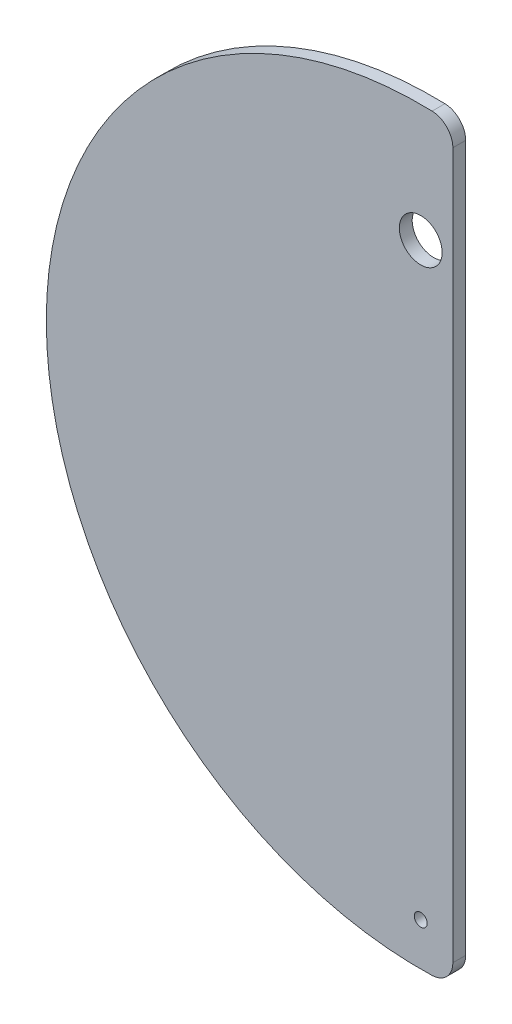
ISO-10303-21;
HEADER;
FILE_DESCRIPTION(('STEP AP214'),'2;1');
FILE_NAME('part.step','',(''),(''),'','','');
FILE_SCHEMA(('AUTOMOTIVE_DESIGN { 1 0 10303 214 1 1 1 1 }'));
ENDSEC;
DATA;
#1=APPLICATION_CONTEXT('core data for automotive mechanical design processes');
#2=APPLICATION_PROTOCOL_DEFINITION('international standard','automotive_design',2000,#1);
#3=PRODUCT_CONTEXT('',#1,'mechanical');
#4=PRODUCT('Part','Part','',(#3));
#5=PRODUCT_RELATED_PRODUCT_CATEGORY('part','',(#4));
#6=PRODUCT_DEFINITION_FORMATION('','',#4);
#7=PRODUCT_DEFINITION_CONTEXT('part definition',#1,'design');
#8=PRODUCT_DEFINITION('design','',#6,#7);
#9=PRODUCT_DEFINITION_SHAPE('','',#8);
#10=(LENGTH_UNIT() NAMED_UNIT(*) SI_UNIT(.MILLI.,.METRE.));
#11=(NAMED_UNIT(*) PLANE_ANGLE_UNIT() SI_UNIT($,.RADIAN.));
#12=(NAMED_UNIT(*) SI_UNIT($,.STERADIAN.) SOLID_ANGLE_UNIT());
#13=UNCERTAINTY_MEASURE_WITH_UNIT(LENGTH_MEASURE(1.E-05),#10,'distance_accuracy_value','');
#14=(GEOMETRIC_REPRESENTATION_CONTEXT(3) GLOBAL_UNCERTAINTY_ASSIGNED_CONTEXT((#13)) GLOBAL_UNIT_ASSIGNED_CONTEXT((#10,
#11,#12)) REPRESENTATION_CONTEXT('',''));
#15=CARTESIAN_POINT('',(0.,0.,0.));
#16=DIRECTION('',(0.,0.,1.));
#17=DIRECTION('',(1.,0.,0.));
#18=AXIS2_PLACEMENT_3D('',#15,#16,#17);
#19=CARTESIAN_POINT('',(0.,0.,6.));
#20=DIRECTION('',(0.,0.,1.));
#21=DIRECTION('',(1.,0.,0.));
#22=AXIS2_PLACEMENT_3D('',#19,#20,#21);
#23=PLANE('',#22);
#24=CARTESIAN_POINT('',(0.,120.,6.));
#25=DIRECTION('',(0.,0.,1.));
#26=DIRECTION('',(1.,0.,0.));
#27=AXIS2_PLACEMENT_3D('',#24,#25,#26);
#28=CIRCLE('',#27,10.);
#29=CARTESIAN_POINT('',(10.,120.,6.));
#30=VERTEX_POINT('',#29);
#31=EDGE_CURVE('E99',#30,#30,#28,.T.);
#32=ORIENTED_EDGE('',*,*,#31,.F.);
#33=EDGE_LOOP('',(#32));
#34=FACE_BOUND('',#33,.T.);
#35=CARTESIAN_POINT('',(0.,0.,6.));
#36=DIRECTION('',(0.,0.,1.));
#37=DIRECTION('',(1.,0.,0.));
#38=AXIS2_PLACEMENT_3D('',#35,#36,#37);
#39=CIRCLE('',#38,175.);
#40=CARTESIAN_POINT('',(5.30303030303036,174.919632601961,6.));
#41=VERTEX_POINT('',#40);
#42=CARTESIAN_POINT('',(5.30303030303036,-174.919632601961,6.));
#43=VERTEX_POINT('',#42);
#44=EDGE_CURVE('E95',#41,#43,#39,.T.);
#45=ORIENTED_EDGE('',*,*,#44,.T.);
#46=CARTESIAN_POINT('',(5.00000000000005,-164.924225024706,6.));
#47=DIRECTION('',(0.,0.,1.));
#48=DIRECTION('',(1.,0.,0.));
#49=AXIS2_PLACEMENT_3D('',#46,#47,#48);
#50=CIRCLE('',#49,10.);
#51=CARTESIAN_POINT('',(15.,-164.924225024706,6.));
#52=VERTEX_POINT('',#51);
#53=EDGE_CURVE('E11',#43,#52,#50,.T.);
#54=ORIENTED_EDGE('',*,*,#53,.T.);
#55=DIRECTION('',(0.,1.,0.));
#56=VECTOR('',#55,1.);
#57=CARTESIAN_POINT('',(15.,174.355957741627,6.));
#58=LINE('',#57,#56);
#59=CARTESIAN_POINT('',(15.,164.924225024706,6.));
#60=VERTEX_POINT('',#59);
#61=EDGE_CURVE('E90',#52,#60,#58,.T.);
#62=ORIENTED_EDGE('',*,*,#61,.T.);
#63=CARTESIAN_POINT('',(5.00000000000005,164.924225024706,6.));
#64=DIRECTION('',(0.,0.,1.));
#65=DIRECTION('',(1.,0.,0.));
#66=AXIS2_PLACEMENT_3D('',#63,#64,#65);
#67=CIRCLE('',#66,10.);
#68=EDGE_CURVE('E41',#60,#41,#67,.T.);
#69=ORIENTED_EDGE('',*,*,#68,.T.);
#70=EDGE_LOOP('',(#45,#54,#62,#69));
#71=FACE_BOUND('',#70,.T.);
#72=CARTESIAN_POINT('',(0.,-155.,6.));
#73=DIRECTION('',(0.,0.,1.));
#74=DIRECTION('',(1.,0.,0.));
#75=AXIS2_PLACEMENT_3D('',#72,#73,#74);
#76=CIRCLE('',#75,3.);
#77=CARTESIAN_POINT('',(3.00000000000005,-155.,6.));
#78=VERTEX_POINT('',#77);
#79=EDGE_CURVE('E115',#78,#78,#76,.T.);
#80=ORIENTED_EDGE('',*,*,#79,.F.);
#81=EDGE_LOOP('',(#80));
#82=FACE_BOUND('',#81,.T.);
#83=ADVANCED_FACE('F33',(#34,#71,#82),#23,.T.);
#84=CARTESIAN_POINT('',(0.,0.,0.));
#85=DIRECTION('',(0.,0.,1.));
#86=DIRECTION('',(1.,0.,0.));
#87=AXIS2_PLACEMENT_3D('',#84,#85,#86);
#88=PLANE('',#87);
#89=CARTESIAN_POINT('',(0.,120.,0.));
#90=DIRECTION('',(0.,0.,1.));
#91=DIRECTION('',(1.,0.,0.));
#92=AXIS2_PLACEMENT_3D('',#89,#90,#91);
#93=CIRCLE('',#92,10.);
#94=CARTESIAN_POINT('',(10.,120.,0.));
#95=VERTEX_POINT('',#94);
#96=EDGE_CURVE('E112',#95,#95,#93,.T.);
#97=ORIENTED_EDGE('',*,*,#96,.T.);
#98=EDGE_LOOP('',(#97));
#99=FACE_BOUND('',#98,.T.);
#100=DIRECTION('',(0.,1.,0.));
#101=VECTOR('',#100,1.);
#102=CARTESIAN_POINT('',(15.,174.355957741627,0.));
#103=LINE('',#102,#101);
#104=CARTESIAN_POINT('',(15.,-164.924225024706,0.));
#105=VERTEX_POINT('',#104);
#106=CARTESIAN_POINT('',(15.,164.924225024706,0.));
#107=VERTEX_POINT('',#106);
#108=EDGE_CURVE('E88',#105,#107,#103,.T.);
#109=ORIENTED_EDGE('',*,*,#108,.F.);
#110=CARTESIAN_POINT('',(5.00000000000005,-164.924225024706,0.));
#111=DIRECTION('',(0.,0.,1.));
#112=DIRECTION('',(1.,0.,0.));
#113=AXIS2_PLACEMENT_3D('',#110,#111,#112);
#114=CIRCLE('',#113,10.);
#115=CARTESIAN_POINT('',(5.30303030303036,-174.919632601961,0.));
#116=VERTEX_POINT('',#115);
#117=EDGE_CURVE('E73',#105,#116,#114,.F.);
#118=ORIENTED_EDGE('',*,*,#117,.T.);
#119=CARTESIAN_POINT('',(0.,0.,0.));
#120=DIRECTION('',(0.,0.,1.));
#121=DIRECTION('',(1.,0.,0.));
#122=AXIS2_PLACEMENT_3D('',#119,#120,#121);
#123=CIRCLE('',#122,175.);
#124=CARTESIAN_POINT('',(5.30303030303036,174.919632601961,0.));
#125=VERTEX_POINT('',#124);
#126=EDGE_CURVE('E96',#125,#116,#123,.T.);
#127=ORIENTED_EDGE('',*,*,#126,.F.);
#128=CARTESIAN_POINT('',(5.00000000000005,164.924225024706,0.));
#129=DIRECTION('',(0.,0.,1.));
#130=DIRECTION('',(1.,0.,0.));
#131=AXIS2_PLACEMENT_3D('',#128,#129,#130);
#132=CIRCLE('',#131,10.);
#133=EDGE_CURVE('E82',#125,#107,#132,.F.);
#134=ORIENTED_EDGE('',*,*,#133,.T.);
#135=EDGE_LOOP('',(#109,#118,#127,#134));
#136=FACE_BOUND('',#135,.T.);
#137=CARTESIAN_POINT('',(0.,-155.,0.));
#138=DIRECTION('',(0.,0.,1.));
#139=DIRECTION('',(1.,0.,0.));
#140=AXIS2_PLACEMENT_3D('',#137,#138,#139);
#141=CIRCLE('',#140,3.);
#142=CARTESIAN_POINT('',(3.00000000000005,-155.,0.));
#143=VERTEX_POINT('',#142);
#144=EDGE_CURVE('E118',#143,#143,#141,.T.);
#145=ORIENTED_EDGE('',*,*,#144,.T.);
#146=EDGE_LOOP('',(#145));
#147=FACE_BOUND('',#146,.T.);
#148=ADVANCED_FACE('F93',(#99,#136,#147),#88,.F.);
#149=CARTESIAN_POINT('',(0.,0.,6.));
#150=DIRECTION('',(0.,0.,-1.));
#151=DIRECTION('',(-1.,0.,0.));
#152=AXIS2_PLACEMENT_3D('',#149,#150,#151);
#153=CYLINDRICAL_SURFACE('',#152,175.);
#154=ORIENTED_EDGE('',*,*,#126,.T.);
#155=DIRECTION('',(0.,0.,-1.));
#156=VECTOR('',#155,1.);
#157=CARTESIAN_POINT('',(5.30303030303035,-174.919632601961,6.));
#158=LINE('',#157,#156);
#159=EDGE_CURVE('E48',#116,#43,#158,.F.);
#160=ORIENTED_EDGE('',*,*,#159,.T.);
#161=ORIENTED_EDGE('',*,*,#44,.F.);
#162=DIRECTION('',(0.,0.,-1.));
#163=VECTOR('',#162,1.);
#164=CARTESIAN_POINT('',(5.30303030303035,174.919632601961,6.));
#165=LINE('',#164,#163);
#166=EDGE_CURVE('E81',#41,#125,#165,.T.);
#167=ORIENTED_EDGE('',*,*,#166,.T.);
#168=EDGE_LOOP('',(#154,#160,#161,#167));
#169=FACE_BOUND('',#168,.T.);
#170=ADVANCED_FACE('F108',(#169),#153,.T.);
#171=CARTESIAN_POINT('',(15.,174.355957741627,6.));
#172=DIRECTION('',(-1.,0.,0.));
#173=DIRECTION('',(0.,0.,1.));
#174=AXIS2_PLACEMENT_3D('',#171,#172,#173);
#175=PLANE('',#174);
#176=ORIENTED_EDGE('',*,*,#61,.F.);
#177=DIRECTION('',(0.,0.,-1.));
#178=VECTOR('',#177,1.);
#179=CARTESIAN_POINT('',(15.,-164.924225024706,6.));
#180=LINE('',#179,#178);
#181=EDGE_CURVE('E77',#52,#105,#180,.T.);
#182=ORIENTED_EDGE('',*,*,#181,.T.);
#183=ORIENTED_EDGE('',*,*,#108,.T.);
#184=DIRECTION('',(0.,0.,-1.));
#185=VECTOR('',#184,1.);
#186=CARTESIAN_POINT('',(15.,164.924225024706,6.));
#187=LINE('',#186,#185);
#188=EDGE_CURVE('E91',#107,#60,#187,.F.);
#189=ORIENTED_EDGE('',*,*,#188,.T.);
#190=EDGE_LOOP('',(#176,#182,#183,#189));
#191=FACE_BOUND('',#190,.T.);
#192=ADVANCED_FACE('F87',(#191),#175,.F.);
#193=CARTESIAN_POINT('',(0.,120.,6.));
#194=DIRECTION('',(0.,0.,-1.));
#195=DIRECTION('',(-1.,0.,0.));
#196=AXIS2_PLACEMENT_3D('',#193,#194,#195);
#197=CYLINDRICAL_SURFACE('',#196,10.);
#198=ORIENTED_EDGE('',*,*,#31,.T.);
#199=EDGE_LOOP('',(#198));
#200=FACE_BOUND('',#199,.T.);
#201=ORIENTED_EDGE('',*,*,#96,.F.);
#202=EDGE_LOOP('',(#201));
#203=FACE_BOUND('',#202,.T.);
#204=ADVANCED_FACE('F136',(#200,#203),#197,.F.);
#205=CARTESIAN_POINT('',(0.,-155.,6.));
#206=DIRECTION('',(0.,0.,-1.));
#207=DIRECTION('',(-1.,0.,0.));
#208=AXIS2_PLACEMENT_3D('',#205,#206,#207);
#209=CYLINDRICAL_SURFACE('',#208,3.);
#210=ORIENTED_EDGE('',*,*,#79,.T.);
#211=EDGE_LOOP('',(#210));
#212=FACE_BOUND('',#211,.T.);
#213=ORIENTED_EDGE('',*,*,#144,.F.);
#214=EDGE_LOOP('',(#213));
#215=FACE_BOUND('',#214,.T.);
#216=ADVANCED_FACE('F124',(#212,#215),#209,.F.);
#217=CARTESIAN_POINT('',(5.00000000000005,-164.924225024706,6.));
#218=DIRECTION('',(0.,0.,-1.));
#219=DIRECTION('',(-1.,0.,0.));
#220=AXIS2_PLACEMENT_3D('',#217,#218,#219);
#221=CYLINDRICAL_SURFACE('',#220,10.);
#222=ORIENTED_EDGE('',*,*,#53,.F.);
#223=ORIENTED_EDGE('',*,*,#159,.F.);
#224=ORIENTED_EDGE('',*,*,#117,.F.);
#225=ORIENTED_EDGE('',*,*,#181,.F.);
#226=EDGE_LOOP('',(#222,#223,#224,#225));
#227=FACE_BOUND('',#226,.T.);
#228=ADVANCED_FACE('F76',(#227),#221,.T.);
#229=CARTESIAN_POINT('',(5.00000000000005,164.924225024706,6.));
#230=DIRECTION('',(0.,0.,-1.));
#231=DIRECTION('',(-1.,0.,0.));
#232=AXIS2_PLACEMENT_3D('',#229,#230,#231);
#233=CYLINDRICAL_SURFACE('',#232,10.);
#234=ORIENTED_EDGE('',*,*,#68,.F.);
#235=ORIENTED_EDGE('',*,*,#188,.F.);
#236=ORIENTED_EDGE('',*,*,#133,.F.);
#237=ORIENTED_EDGE('',*,*,#166,.F.);
#238=EDGE_LOOP('',(#234,#235,#236,#237));
#239=FACE_BOUND('',#238,.T.);
#240=ADVANCED_FACE('F35',(#239),#233,.T.);
#241=CLOSED_SHELL('',(#83,#148,#170,#192,#204,#216,#228,#240));
#242=MANIFOLD_SOLID_BREP('B2',#241);
#243=ADVANCED_BREP_SHAPE_REPRESENTATION('',(#18,#242),#14);
#244=SHAPE_DEFINITION_REPRESENTATION(#9,#243);
ENDSEC;
END-ISO-10303-21;
